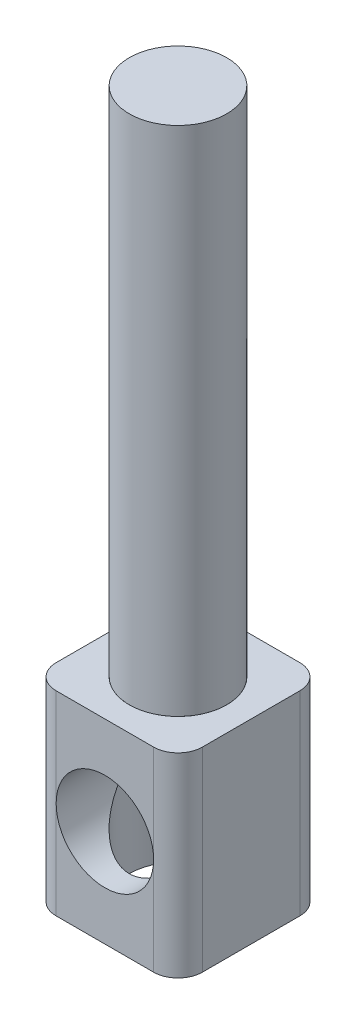
ISO-10303-21;
HEADER;
FILE_DESCRIPTION(('STEP AP214'),'2;1');
FILE_NAME('part.step','',(''),(''),'','','');
FILE_SCHEMA(('AUTOMOTIVE_DESIGN { 1 0 10303 214 1 1 1 1 }'));
ENDSEC;
DATA;
#1=APPLICATION_CONTEXT('core data for automotive mechanical design processes');
#2=APPLICATION_PROTOCOL_DEFINITION('international standard','automotive_design',2000,#1);
#3=PRODUCT_CONTEXT('',#1,'mechanical');
#4=PRODUCT('Part','Part','',(#3));
#5=PRODUCT_RELATED_PRODUCT_CATEGORY('part','',(#4));
#6=PRODUCT_DEFINITION_FORMATION('','',#4);
#7=PRODUCT_DEFINITION_CONTEXT('part definition',#1,'design');
#8=PRODUCT_DEFINITION('design','',#6,#7);
#9=PRODUCT_DEFINITION_SHAPE('','',#8);
#10=(LENGTH_UNIT() NAMED_UNIT(*) SI_UNIT(.MILLI.,.METRE.));
#11=(NAMED_UNIT(*) PLANE_ANGLE_UNIT() SI_UNIT($,.RADIAN.));
#12=(NAMED_UNIT(*) SI_UNIT($,.STERADIAN.) SOLID_ANGLE_UNIT());
#13=UNCERTAINTY_MEASURE_WITH_UNIT(LENGTH_MEASURE(1.E-05),#10,'distance_accuracy_value','');
#14=(GEOMETRIC_REPRESENTATION_CONTEXT(3) GLOBAL_UNCERTAINTY_ASSIGNED_CONTEXT((#13)) GLOBAL_UNIT_ASSIGNED_CONTEXT((#10,
#11,#12)) REPRESENTATION_CONTEXT('',''));
#15=CARTESIAN_POINT('',(0.,0.,0.));
#16=DIRECTION('',(0.,0.,1.));
#17=DIRECTION('',(1.,0.,0.));
#18=AXIS2_PLACEMENT_3D('',#15,#16,#17);
#19=CARTESIAN_POINT('',(0.,29.,0.));
#20=DIRECTION('',(0.,-1.,0.));
#21=DIRECTION('',(0.,0.,-1.));
#22=AXIS2_PLACEMENT_3D('',#19,#20,#21);
#23=CYLINDRICAL_SURFACE('',#22,1.99840551013876);
#24=CARTESIAN_POINT('',(0.,29.,0.));
#25=DIRECTION('',(0.,1.,0.));
#26=DIRECTION('',(0.,0.,1.));
#27=AXIS2_PLACEMENT_3D('',#24,#25,#26);
#28=CIRCLE('',#27,1.99840551013876);
#29=CARTESIAN_POINT('',(0.,29.,-1.99840551013876));
#30=VERTEX_POINT('',#29);
#31=EDGE_CURVE('E11',#30,#30,#28,.T.);
#32=CARTESIAN_POINT('',(0.,8.,0.));
#33=DIRECTION('',(0.,1.,0.));
#34=DIRECTION('',(0.,0.,1.));
#35=AXIS2_PLACEMENT_3D('',#32,#33,#34);
#36=CIRCLE('',#35,1.99840551013876);
#37=CARTESIAN_POINT('',(0.,8.,-1.99840551013876));
#38=VERTEX_POINT('',#37);
#39=EDGE_CURVE('E52',#38,#38,#36,.T.);
#40=CARTESIAN_POINT('',(0.,29.,-1.99840551013876));
#41=CARTESIAN_POINT('',(0.,28.78125,-1.99840551013876));
#42=CARTESIAN_POINT('',(0.,28.5625,-1.99840551013876));
#43=CARTESIAN_POINT('',(0.,28.125,-1.99840551013876));
#44=CARTESIAN_POINT('',(0.,27.90625,-1.99840551013876));
#45=CARTESIAN_POINT('',(0.,27.46875,-1.99840551013876));
#46=CARTESIAN_POINT('',(0.,27.25,-1.99840551013876));
#47=CARTESIAN_POINT('',(0.,26.8125,-1.99840551013876));
#48=CARTESIAN_POINT('',(0.,26.59375,-1.99840551013876));
#49=CARTESIAN_POINT('',(0.,26.15625,-1.99840551013876));
#50=CARTESIAN_POINT('',(0.,25.9375,-1.99840551013876));
#51=CARTESIAN_POINT('',(0.,25.5,-1.99840551013876));
#52=CARTESIAN_POINT('',(0.,25.28125,-1.99840551013876));
#53=CARTESIAN_POINT('',(0.,24.84375,-1.99840551013876));
#54=CARTESIAN_POINT('',(0.,24.625,-1.99840551013876));
#55=CARTESIAN_POINT('',(0.,24.1875,-1.99840551013876));
#56=CARTESIAN_POINT('',(0.,23.96875,-1.99840551013876));
#57=CARTESIAN_POINT('',(0.,23.53125,-1.99840551013876));
#58=CARTESIAN_POINT('',(0.,23.3125,-1.99840551013876));
#59=CARTESIAN_POINT('',(0.,22.875,-1.99840551013876));
#60=CARTESIAN_POINT('',(0.,22.65625,-1.99840551013876));
#61=CARTESIAN_POINT('',(0.,22.21875,-1.99840551013876));
#62=CARTESIAN_POINT('',(0.,22.,-1.99840551013876));
#63=CARTESIAN_POINT('',(0.,21.5625,-1.99840551013876));
#64=CARTESIAN_POINT('',(0.,21.34375,-1.99840551013876));
#65=CARTESIAN_POINT('',(0.,20.90625,-1.99840551013876));
#66=CARTESIAN_POINT('',(0.,20.6875,-1.99840551013876));
#67=CARTESIAN_POINT('',(0.,20.25,-1.99840551013876));
#68=CARTESIAN_POINT('',(0.,20.03125,-1.99840551013876));
#69=CARTESIAN_POINT('',(0.,19.59375,-1.99840551013876));
#70=CARTESIAN_POINT('',(0.,19.375,-1.99840551013876));
#71=CARTESIAN_POINT('',(0.,18.9375,-1.99840551013876));
#72=CARTESIAN_POINT('',(0.,18.71875,-1.99840551013876));
#73=CARTESIAN_POINT('',(0.,18.28125,-1.99840551013876));
#74=CARTESIAN_POINT('',(0.,18.0625,-1.99840551013876));
#75=CARTESIAN_POINT('',(0.,17.625,-1.99840551013876));
#76=CARTESIAN_POINT('',(0.,17.40625,-1.99840551013876));
#77=CARTESIAN_POINT('',(0.,16.96875,-1.99840551013876));
#78=CARTESIAN_POINT('',(0.,16.75,-1.99840551013876));
#79=CARTESIAN_POINT('',(0.,16.3125,-1.99840551013876));
#80=CARTESIAN_POINT('',(0.,16.09375,-1.99840551013876));
#81=CARTESIAN_POINT('',(0.,15.65625,-1.99840551013876));
#82=CARTESIAN_POINT('',(0.,15.4375,-1.99840551013876));
#83=CARTESIAN_POINT('',(0.,15.,-1.99840551013876));
#84=CARTESIAN_POINT('',(0.,14.78125,-1.99840551013876));
#85=CARTESIAN_POINT('',(0.,14.34375,-1.99840551013876));
#86=CARTESIAN_POINT('',(0.,14.125,-1.99840551013876));
#87=CARTESIAN_POINT('',(0.,13.6875,-1.99840551013876));
#88=CARTESIAN_POINT('',(0.,13.46875,-1.99840551013876));
#89=CARTESIAN_POINT('',(0.,13.03125,-1.99840551013876));
#90=CARTESIAN_POINT('',(0.,12.8125,-1.99840551013876));
#91=CARTESIAN_POINT('',(0.,12.375,-1.99840551013876));
#92=CARTESIAN_POINT('',(0.,12.15625,-1.99840551013876));
#93=CARTESIAN_POINT('',(0.,11.71875,-1.99840551013876));
#94=CARTESIAN_POINT('',(0.,11.5,-1.99840551013876));
#95=CARTESIAN_POINT('',(0.,11.0625,-1.99840551013876));
#96=CARTESIAN_POINT('',(0.,10.84375,-1.99840551013876));
#97=CARTESIAN_POINT('',(0.,10.40625,-1.99840551013876));
#98=CARTESIAN_POINT('',(0.,10.1875,-1.99840551013876));
#99=CARTESIAN_POINT('',(0.,9.75,-1.99840551013876));
#100=CARTESIAN_POINT('',(0.,9.53125,-1.99840551013876));
#101=CARTESIAN_POINT('',(0.,9.09375,-1.99840551013876));
#102=CARTESIAN_POINT('',(0.,8.875,-1.99840551013876));
#103=CARTESIAN_POINT('',(0.,8.4375,-1.99840551013876));
#104=CARTESIAN_POINT('',(0.,8.21875,-1.99840551013876));
#105=CARTESIAN_POINT('',(0.,8.,-1.99840551013876));
#106=B_SPLINE_CURVE_WITH_KNOTS('',3,(#40,#41,#42,#43,#44,#45,#46,#47,#48,#49,#50,#51,#52,#53,
#54,#55,#56,#57,#58,#59,#60,#61,#62,#63,#64,#65,#66,#67,#68,#69,#70,#71,#72,#73,#74,#75,#76,#77,
#78,#79,#80,#81,#82,#83,#84,#85,#86,#87,#88,#89,#90,#91,#92,#93,#94,#95,#96,#97,#98,#99,#100,
#101,#102,#103,#104,#105),.UNSPECIFIED.,.F.,.F.,(4,2,2,2,2,2,2,2,2,2,2,2,2,2,2,2,2,2,2,2,2,2,2,
2,2,2,2,2,2,2,2,2,4),(0.,0.656249999999997,1.3125,1.96875,2.625,3.28125,3.9375,4.59375,5.25,
5.90625,6.5625,7.21875,7.875,8.53125,9.1875,9.84375,10.5,11.15625,11.8125,12.46875,13.125,
13.78125,14.4375,15.09375,15.75,16.40625,17.0625,17.71875,18.375,19.03125,19.6875,20.34375,21.),.UNSPECIFIED.);
#107=EDGE_CURVE('BSEAM49',#30,#38,#106,.T.);
#108=ORIENTED_EDGE('',*,*,#31,.F.);
#109=ORIENTED_EDGE('',*,*,#39,.T.);
#110=ORIENTED_EDGE('',*,*,#107,.T.);
#111=ORIENTED_EDGE('',*,*,#107,.F.);
#112=EDGE_LOOP('',(#108,#110,#109,#111));
#113=FACE_BOUND('',#112,.T.);
#114=ADVANCED_FACE('F49',(#113),#23,.T.);
#115=CARTESIAN_POINT('',(0.,29.,0.));
#116=DIRECTION('',(0.,1.,0.));
#117=DIRECTION('',(0.,0.,1.));
#118=AXIS2_PLACEMENT_3D('',#115,#116,#117);
#119=PLANE('',#118);
#120=ORIENTED_EDGE('',*,*,#31,.T.);
#121=EDGE_LOOP('',(#120));
#122=FACE_BOUND('',#121,.T.);
#123=ADVANCED_FACE('F66',(#122),#119,.T.);
#124=CARTESIAN_POINT('',(0.,8.,0.));
#125=DIRECTION('',(0.,1.,0.));
#126=DIRECTION('',(0.,0.,1.));
#127=AXIS2_PLACEMENT_3D('',#124,#125,#126);
#128=PLANE('',#127);
#129=ORIENTED_EDGE('',*,*,#39,.F.);
#130=EDGE_LOOP('',(#129));
#131=FACE_BOUND('',#130,.T.);
#132=ADVANCED_FACE('F64',(#131),#128,.F.);
#133=CLOSED_SHELL('',(#114,#123,#132));
#134=MANIFOLD_SOLID_BREP('B2',#133);
#135=CARTESIAN_POINT('',(3.,8.,3.));
#136=DIRECTION('',(0.,0.,-1.));
#137=DIRECTION('',(-1.,0.,0.));
#138=AXIS2_PLACEMENT_3D('',#135,#136,#137);
#139=PLANE('',#138);
#140=DIRECTION('',(1.,0.,0.));
#141=VECTOR('',#140,1.);
#142=CARTESIAN_POINT('',(3.,8.,3.));
#143=LINE('',#142,#141);
#144=CARTESIAN_POINT('',(-2.,8.,3.));
#145=VERTEX_POINT('',#144);
#146=CARTESIAN_POINT('',(2.,8.,3.));
#147=VERTEX_POINT('',#146);
#148=EDGE_CURVE('E244',#145,#147,#143,.T.);
#149=ORIENTED_EDGE('',*,*,#148,.F.);
#150=DIRECTION('',(0.,-1.,0.));
#151=VECTOR('',#150,1.);
#152=CARTESIAN_POINT('',(-2.,8.,3.));
#153=LINE('',#152,#151);
#154=CARTESIAN_POINT('',(-2.,4.,3.));
#155=VERTEX_POINT('',#154);
#156=EDGE_CURVE('E188',#145,#155,#153,.T.);
#157=ORIENTED_EDGE('',*,*,#156,.T.);
#158=CARTESIAN_POINT('',(0.,4.,3.));
#159=DIRECTION('',(0.,0.,1.));
#160=DIRECTION('',(1.,0.,0.));
#161=AXIS2_PLACEMENT_3D('',#158,#159,#160);
#162=CIRCLE('',#161,2.);
#163=CARTESIAN_POINT('',(2.,4.,3.));
#164=VERTEX_POINT('',#163);
#165=EDGE_CURVE('E252',#164,#155,#162,.T.);
#166=ORIENTED_EDGE('',*,*,#165,.F.);
#167=DIRECTION('',(0.,-1.,0.));
#168=VECTOR('',#167,1.);
#169=CARTESIAN_POINT('',(2.,8.,3.));
#170=LINE('',#169,#168);
#171=EDGE_CURVE('E179',#164,#147,#170,.F.);
#172=ORIENTED_EDGE('',*,*,#171,.T.);
#173=EDGE_LOOP('',(#149,#157,#166,#172));
#174=FACE_BOUND('',#173,.T.);
#175=ADVANCED_FACE('F92',(#174),#139,.F.);
#176=CARTESIAN_POINT('',(0.,8.,0.));
#177=DIRECTION('',(0.,1.,0.));
#178=DIRECTION('',(0.,0.,1.));
#179=AXIS2_PLACEMENT_3D('',#176,#177,#178);
#180=PLANE('',#179);
#181=DIRECTION('',(0.,0.,1.));
#182=VECTOR('',#181,1.);
#183=CARTESIAN_POINT('',(-3.,8.,3.));
#184=LINE('',#183,#182);
#185=CARTESIAN_POINT('',(-3.,8.,-2.));
#186=VERTEX_POINT('',#185);
#187=CARTESIAN_POINT('',(-3.,8.,2.));
#188=VERTEX_POINT('',#187);
#189=EDGE_CURVE('E235',#186,#188,#184,.T.);
#190=ORIENTED_EDGE('',*,*,#189,.T.);
#191=CARTESIAN_POINT('',(-2.,8.,2.));
#192=DIRECTION('',(0.,1.,0.));
#193=DIRECTION('',(0.,0.,1.));
#194=AXIS2_PLACEMENT_3D('',#191,#192,#193);
#195=CIRCLE('',#194,1.);
#196=EDGE_CURVE('E209',#188,#145,#195,.T.);
#197=ORIENTED_EDGE('',*,*,#196,.T.);
#198=ORIENTED_EDGE('',*,*,#148,.T.);
#199=CARTESIAN_POINT('',(2.,8.,2.));
#200=DIRECTION('',(0.,1.,0.));
#201=DIRECTION('',(0.,0.,1.));
#202=AXIS2_PLACEMENT_3D('',#199,#200,#201);
#203=CIRCLE('',#202,1.);
#204=CARTESIAN_POINT('',(3.,8.,2.));
#205=VERTEX_POINT('',#204);
#206=EDGE_CURVE('E204',#147,#205,#203,.T.);
#207=ORIENTED_EDGE('',*,*,#206,.T.);
#208=DIRECTION('',(0.,0.,-1.));
#209=VECTOR('',#208,1.);
#210=CARTESIAN_POINT('',(3.,8.,3.));
#211=LINE('',#210,#209);
#212=CARTESIAN_POINT('',(3.,8.,-2.));
#213=VERTEX_POINT('',#212);
#214=EDGE_CURVE('E223',#205,#213,#211,.T.);
#215=ORIENTED_EDGE('',*,*,#214,.T.);
#216=CARTESIAN_POINT('',(2.,8.,-2.));
#217=DIRECTION('',(0.,1.,0.));
#218=DIRECTION('',(0.,0.,1.));
#219=AXIS2_PLACEMENT_3D('',#216,#217,#218);
#220=CIRCLE('',#219,1.);
#221=CARTESIAN_POINT('',(2.,8.,-3.));
#222=VERTEX_POINT('',#221);
#223=EDGE_CURVE('E114',#213,#222,#220,.T.);
#224=ORIENTED_EDGE('',*,*,#223,.T.);
#225=DIRECTION('',(-1.,0.,0.));
#226=VECTOR('',#225,1.);
#227=CARTESIAN_POINT('',(3.,8.,-3.));
#228=LINE('',#227,#226);
#229=CARTESIAN_POINT('',(-2.,8.,-3.));
#230=VERTEX_POINT('',#229);
#231=EDGE_CURVE('E175',#222,#230,#228,.T.);
#232=ORIENTED_EDGE('',*,*,#231,.T.);
#233=CARTESIAN_POINT('',(-2.,8.,-2.));
#234=DIRECTION('',(0.,1.,0.));
#235=DIRECTION('',(0.,0.,1.));
#236=AXIS2_PLACEMENT_3D('',#233,#234,#235);
#237=CIRCLE('',#236,1.);
#238=EDGE_CURVE('E207',#230,#186,#237,.T.);
#239=ORIENTED_EDGE('',*,*,#238,.T.);
#240=EDGE_LOOP('',(#190,#197,#198,#207,#215,#224,#232,#239));
#241=FACE_BOUND('',#240,.T.);
#242=CARTESIAN_POINT('',(0.,8.,0.));
#243=DIRECTION('',(0.,1.,0.));
#244=DIRECTION('',(0.,0.,1.));
#245=AXIS2_PLACEMENT_3D('',#242,#243,#244);
#246=CIRCLE('',#245,2.);
#247=CARTESIAN_POINT('',(0.,8.,2.));
#248=VERTEX_POINT('',#247);
#249=EDGE_CURVE('E241',#248,#248,#246,.T.);
#250=ORIENTED_EDGE('',*,*,#249,.F.);
#251=EDGE_LOOP('',(#250));
#252=FACE_BOUND('',#251,.T.);
#253=ADVANCED_FACE('F266',(#241,#252),#180,.T.);
#254=CARTESIAN_POINT('',(0.,0.,0.));
#255=DIRECTION('',(0.,1.,0.));
#256=DIRECTION('',(0.,0.,1.));
#257=AXIS2_PLACEMENT_3D('',#254,#255,#256);
#258=PLANE('',#257);
#259=DIRECTION('',(1.,0.,0.));
#260=VECTOR('',#259,1.);
#261=CARTESIAN_POINT('',(3.,0.,3.));
#262=LINE('',#261,#260);
#263=CARTESIAN_POINT('',(-2.,0.,3.));
#264=VERTEX_POINT('',#263);
#265=CARTESIAN_POINT('',(2.,0.,3.));
#266=VERTEX_POINT('',#265);
#267=EDGE_CURVE('E233',#264,#266,#262,.T.);
#268=ORIENTED_EDGE('',*,*,#267,.F.);
#269=CARTESIAN_POINT('',(-2.,0.,2.));
#270=DIRECTION('',(0.,1.,0.));
#271=DIRECTION('',(0.,0.,1.));
#272=AXIS2_PLACEMENT_3D('',#269,#270,#271);
#273=CIRCLE('',#272,1.);
#274=CARTESIAN_POINT('',(-3.,0.,2.));
#275=VERTEX_POINT('',#274);
#276=EDGE_CURVE('E197',#264,#275,#273,.F.);
#277=ORIENTED_EDGE('',*,*,#276,.T.);
#278=DIRECTION('',(0.,0.,1.));
#279=VECTOR('',#278,1.);
#280=CARTESIAN_POINT('',(-3.,0.,3.));
#281=LINE('',#280,#279);
#282=CARTESIAN_POINT('',(-3.,0.,-2.));
#283=VERTEX_POINT('',#282);
#284=EDGE_CURVE('E236',#283,#275,#281,.T.);
#285=ORIENTED_EDGE('',*,*,#284,.F.);
#286=CARTESIAN_POINT('',(-2.,0.,-2.));
#287=DIRECTION('',(0.,1.,0.));
#288=DIRECTION('',(0.,0.,1.));
#289=AXIS2_PLACEMENT_3D('',#286,#287,#288);
#290=CIRCLE('',#289,1.);
#291=CARTESIAN_POINT('',(-2.,0.,-3.));
#292=VERTEX_POINT('',#291);
#293=EDGE_CURVE('E195',#283,#292,#290,.F.);
#294=ORIENTED_EDGE('',*,*,#293,.T.);
#295=DIRECTION('',(-1.,0.,0.));
#296=VECTOR('',#295,1.);
#297=CARTESIAN_POINT('',(3.,0.,-3.));
#298=LINE('',#297,#296);
#299=CARTESIAN_POINT('',(2.,0.,-3.));
#300=VERTEX_POINT('',#299);
#301=EDGE_CURVE('E232',#300,#292,#298,.T.);
#302=ORIENTED_EDGE('',*,*,#301,.F.);
#303=CARTESIAN_POINT('',(2.,0.,-2.));
#304=DIRECTION('',(0.,1.,0.));
#305=DIRECTION('',(0.,0.,1.));
#306=AXIS2_PLACEMENT_3D('',#303,#304,#305);
#307=CIRCLE('',#306,1.);
#308=CARTESIAN_POINT('',(3.,0.,-2.));
#309=VERTEX_POINT('',#308);
#310=EDGE_CURVE('E193',#300,#309,#307,.F.);
#311=ORIENTED_EDGE('',*,*,#310,.T.);
#312=DIRECTION('',(0.,0.,-1.));
#313=VECTOR('',#312,1.);
#314=CARTESIAN_POINT('',(3.,0.,3.));
#315=LINE('',#314,#313);
#316=CARTESIAN_POINT('',(3.,0.,2.));
#317=VERTEX_POINT('',#316);
#318=EDGE_CURVE('E221',#317,#309,#315,.T.);
#319=ORIENTED_EDGE('',*,*,#318,.F.);
#320=CARTESIAN_POINT('',(2.,0.,2.));
#321=DIRECTION('',(0.,1.,0.));
#322=DIRECTION('',(0.,0.,1.));
#323=AXIS2_PLACEMENT_3D('',#320,#321,#322);
#324=CIRCLE('',#323,1.);
#325=EDGE_CURVE('E191',#317,#266,#324,.F.);
#326=ORIENTED_EDGE('',*,*,#325,.T.);
#327=EDGE_LOOP('',(#268,#277,#285,#294,#302,#311,#319,#326));
#328=FACE_BOUND('',#327,.T.);
#329=CARTESIAN_POINT('',(0.,0.,0.));
#330=DIRECTION('',(0.,1.,0.));
#331=DIRECTION('',(0.,0.,1.));
#332=AXIS2_PLACEMENT_3D('',#329,#330,#331);
#333=CIRCLE('',#332,2.);
#334=CARTESIAN_POINT('',(0.,0.,2.));
#335=VERTEX_POINT('',#334);
#336=EDGE_CURVE('E249',#335,#335,#333,.T.);
#337=ORIENTED_EDGE('',*,*,#336,.T.);
#338=EDGE_LOOP('',(#337));
#339=FACE_BOUND('',#338,.T.);
#340=ADVANCED_FACE('F228',(#328,#339),#258,.F.);
#341=CARTESIAN_POINT('',(-3.,8.,3.));
#342=DIRECTION('',(1.,0.,0.));
#343=DIRECTION('',(0.,0.,-1.));
#344=AXIS2_PLACEMENT_3D('',#341,#342,#343);
#345=PLANE('',#344);
#346=ORIENTED_EDGE('',*,*,#284,.T.);
#347=DIRECTION('',(0.,-1.,0.));
#348=VECTOR('',#347,1.);
#349=CARTESIAN_POINT('',(-3.,8.,2.));
#350=LINE('',#349,#348);
#351=EDGE_CURVE('E202',#275,#188,#350,.F.);
#352=ORIENTED_EDGE('',*,*,#351,.T.);
#353=ORIENTED_EDGE('',*,*,#189,.F.);
#354=DIRECTION('',(0.,-1.,0.));
#355=VECTOR('',#354,1.);
#356=CARTESIAN_POINT('',(-3.,8.,-2.));
#357=LINE('',#356,#355);
#358=EDGE_CURVE('E199',#186,#283,#357,.T.);
#359=ORIENTED_EDGE('',*,*,#358,.T.);
#360=EDGE_LOOP('',(#346,#352,#353,#359));
#361=FACE_BOUND('',#360,.T.);
#362=ADVANCED_FACE('F276',(#361),#345,.F.);
#363=EDGE_CURVE('E256',#155,#164,#162,.T.);
#364=ORIENTED_EDGE('',*,*,#363,.F.);
#365=DIRECTION('',(0.,-1.,0.));
#366=VECTOR('',#365,1.);
#367=CARTESIAN_POINT('',(-2.,8.,3.));
#368=LINE('',#367,#366);
#369=EDGE_CURVE('E186',#155,#264,#368,.T.);
#370=ORIENTED_EDGE('',*,*,#369,.T.);
#371=ORIENTED_EDGE('',*,*,#267,.T.);
#372=DIRECTION('',(0.,-1.,0.));
#373=VECTOR('',#372,1.);
#374=CARTESIAN_POINT('',(2.,8.,3.));
#375=LINE('',#374,#373);
#376=EDGE_CURVE('E181',#266,#164,#375,.F.);
#377=ORIENTED_EDGE('',*,*,#376,.T.);
#378=EDGE_LOOP('',(#364,#370,#371,#377));
#379=FACE_BOUND('',#378,.T.);
#380=ADVANCED_FACE('F273',(#379),#139,.F.);
#381=CARTESIAN_POINT('',(3.,8.,3.));
#382=DIRECTION('',(-1.,0.,0.));
#383=DIRECTION('',(0.,0.,1.));
#384=AXIS2_PLACEMENT_3D('',#381,#382,#383);
#385=PLANE('',#384);
#386=ORIENTED_EDGE('',*,*,#318,.T.);
#387=DIRECTION('',(0.,-1.,0.));
#388=VECTOR('',#387,1.);
#389=CARTESIAN_POINT('',(3.,8.,-2.));
#390=LINE('',#389,#388);
#391=EDGE_CURVE('E47',#309,#213,#390,.F.);
#392=ORIENTED_EDGE('',*,*,#391,.T.);
#393=ORIENTED_EDGE('',*,*,#214,.F.);
#394=DIRECTION('',(0.,-1.,0.));
#395=VECTOR('',#394,1.);
#396=CARTESIAN_POINT('',(3.,8.,2.));
#397=LINE('',#396,#395);
#398=EDGE_CURVE('E100',#205,#317,#397,.T.);
#399=ORIENTED_EDGE('',*,*,#398,.T.);
#400=EDGE_LOOP('',(#386,#392,#393,#399));
#401=FACE_BOUND('',#400,.T.);
#402=ADVANCED_FACE('F220',(#401),#385,.F.);
#403=CARTESIAN_POINT('',(3.,8.,-3.));
#404=DIRECTION('',(0.,0.,1.));
#405=DIRECTION('',(1.,0.,0.));
#406=AXIS2_PLACEMENT_3D('',#403,#404,#405);
#407=PLANE('',#406);
#408=ORIENTED_EDGE('',*,*,#301,.T.);
#409=DIRECTION('',(0.,-1.,0.));
#410=VECTOR('',#409,1.);
#411=CARTESIAN_POINT('',(-2.,8.,-3.));
#412=LINE('',#411,#410);
#413=EDGE_CURVE('E107',#292,#230,#412,.F.);
#414=ORIENTED_EDGE('',*,*,#413,.T.);
#415=ORIENTED_EDGE('',*,*,#231,.F.);
#416=DIRECTION('',(0.,-1.,0.));
#417=VECTOR('',#416,1.);
#418=CARTESIAN_POINT('',(2.,8.,-3.));
#419=LINE('',#418,#417);
#420=EDGE_CURVE('E211',#222,#300,#419,.T.);
#421=ORIENTED_EDGE('',*,*,#420,.T.);
#422=EDGE_LOOP('',(#408,#414,#415,#421));
#423=FACE_BOUND('',#422,.T.);
#424=ADVANCED_FACE('F282',(#423),#407,.F.);
#425=CARTESIAN_POINT('',(0.,8.,0.));
#426=DIRECTION('',(0.,-1.,0.));
#427=DIRECTION('',(0.,0.,-1.));
#428=AXIS2_PLACEMENT_3D('',#425,#426,#427);
#429=CYLINDRICAL_SURFACE('',#428,2.);
#430=CARTESIAN_POINT('',(0.,4.,0.));
#431=DIRECTION('',(0.,-0.707106781186547,0.707106781186547));
#432=DIRECTION('',(0.,-0.707106781186547,-0.707106781186547));
#433=AXIS2_PLACEMENT_3D('',#430,#431,#432);
#434=ELLIPSE('',#433,2.82842712474619,2.);
#435=CARTESIAN_POINT('',(-2.,4.,0.));
#436=VERTEX_POINT('',#435);
#437=CARTESIAN_POINT('',(2.,4.,0.));
#438=VERTEX_POINT('',#437);
#439=EDGE_CURVE('E173',#436,#438,#434,.F.);
#440=ORIENTED_EDGE('',*,*,#439,.F.);
#441=CARTESIAN_POINT('',(0.,4.,0.));
#442=DIRECTION('',(0.,-0.707106781186547,-0.707106781186547));
#443=DIRECTION('',(0.,-0.707106781186547,0.707106781186547));
#444=AXIS2_PLACEMENT_3D('',#441,#442,#443);
#445=ELLIPSE('',#444,2.82842712474619,2.);
#446=EDGE_CURVE('E169',#438,#436,#445,.T.);
#447=ORIENTED_EDGE('',*,*,#446,.F.);
#448=EDGE_LOOP('',(#440,#447));
#449=FACE_BOUND('',#448,.T.);
#450=ORIENTED_EDGE('',*,*,#249,.T.);
#451=EDGE_LOOP('',(#450));
#452=FACE_BOUND('',#451,.T.);
#453=ORIENTED_EDGE('',*,*,#336,.F.);
#454=EDGE_LOOP('',(#453));
#455=FACE_BOUND('',#454,.T.);
#456=ADVANCED_FACE('F177',(#449,#452,#455),#429,.F.);
#457=CARTESIAN_POINT('',(0.,4.,0.));
#458=DIRECTION('',(0.,0.,1.));
#459=DIRECTION('',(1.,0.,0.));
#460=AXIS2_PLACEMENT_3D('',#457,#458,#459);
#461=CYLINDRICAL_SURFACE('',#460,2.);
#462=ORIENTED_EDGE('',*,*,#439,.T.);
#463=ORIENTED_EDGE('',*,*,#446,.T.);
#464=EDGE_LOOP('',(#462,#463));
#465=FACE_BOUND('',#464,.T.);
#466=ORIENTED_EDGE('',*,*,#165,.T.);
#467=ORIENTED_EDGE('',*,*,#363,.T.);
#468=EDGE_LOOP('',(#466,#467));
#469=FACE_BOUND('',#468,.T.);
#470=ADVANCED_FACE('F171',(#465,#469),#461,.F.);
#471=CARTESIAN_POINT('',(-2.,8.,2.));
#472=DIRECTION('',(0.,-1.,0.));
#473=DIRECTION('',(0.,0.,-1.));
#474=AXIS2_PLACEMENT_3D('',#471,#472,#473);
#475=CYLINDRICAL_SURFACE('',#474,1.);
#476=ORIENTED_EDGE('',*,*,#196,.F.);
#477=ORIENTED_EDGE('',*,*,#351,.F.);
#478=ORIENTED_EDGE('',*,*,#276,.F.);
#479=ORIENTED_EDGE('',*,*,#369,.F.);
#480=ORIENTED_EDGE('',*,*,#156,.F.);
#481=EDGE_LOOP('',(#476,#477,#478,#479,#480));
#482=FACE_BOUND('',#481,.T.);
#483=ADVANCED_FACE('F270',(#482),#475,.T.);
#484=CARTESIAN_POINT('',(-2.,8.,-2.));
#485=DIRECTION('',(0.,-1.,0.));
#486=DIRECTION('',(0.,0.,-1.));
#487=AXIS2_PLACEMENT_3D('',#484,#485,#486);
#488=CYLINDRICAL_SURFACE('',#487,1.);
#489=ORIENTED_EDGE('',*,*,#238,.F.);
#490=ORIENTED_EDGE('',*,*,#413,.F.);
#491=ORIENTED_EDGE('',*,*,#293,.F.);
#492=ORIENTED_EDGE('',*,*,#358,.F.);
#493=EDGE_LOOP('',(#489,#490,#491,#492));
#494=FACE_BOUND('',#493,.T.);
#495=ADVANCED_FACE('F281',(#494),#488,.T.);
#496=CARTESIAN_POINT('',(2.,8.,-2.));
#497=DIRECTION('',(0.,-1.,0.));
#498=DIRECTION('',(0.,0.,-1.));
#499=AXIS2_PLACEMENT_3D('',#496,#497,#498);
#500=CYLINDRICAL_SURFACE('',#499,1.);
#501=ORIENTED_EDGE('',*,*,#223,.F.);
#502=ORIENTED_EDGE('',*,*,#391,.F.);
#503=ORIENTED_EDGE('',*,*,#310,.F.);
#504=ORIENTED_EDGE('',*,*,#420,.F.);
#505=EDGE_LOOP('',(#501,#502,#503,#504));
#506=FACE_BOUND('',#505,.T.);
#507=ADVANCED_FACE('F285',(#506),#500,.T.);
#508=CARTESIAN_POINT('',(2.,8.,2.));
#509=DIRECTION('',(0.,-1.,0.));
#510=DIRECTION('',(0.,0.,-1.));
#511=AXIS2_PLACEMENT_3D('',#508,#509,#510);
#512=CYLINDRICAL_SURFACE('',#511,1.);
#513=ORIENTED_EDGE('',*,*,#171,.F.);
#514=ORIENTED_EDGE('',*,*,#376,.F.);
#515=ORIENTED_EDGE('',*,*,#325,.F.);
#516=ORIENTED_EDGE('',*,*,#398,.F.);
#517=ORIENTED_EDGE('',*,*,#206,.F.);
#518=EDGE_LOOP('',(#513,#514,#515,#516,#517));
#519=FACE_BOUND('',#518,.T.);
#520=ADVANCED_FACE('F94',(#519),#512,.T.);
#521=CLOSED_SHELL('',(#175,#253,#340,#362,#380,#402,#424,#456,#470,#483,#495,#507,#520));
#522=MANIFOLD_SOLID_BREP('B6',#521);
#523=ADVANCED_BREP_SHAPE_REPRESENTATION('',(#18,#134,#522),#14);
#524=SHAPE_DEFINITION_REPRESENTATION(#9,#523);
ENDSEC;
END-ISO-10303-21;
